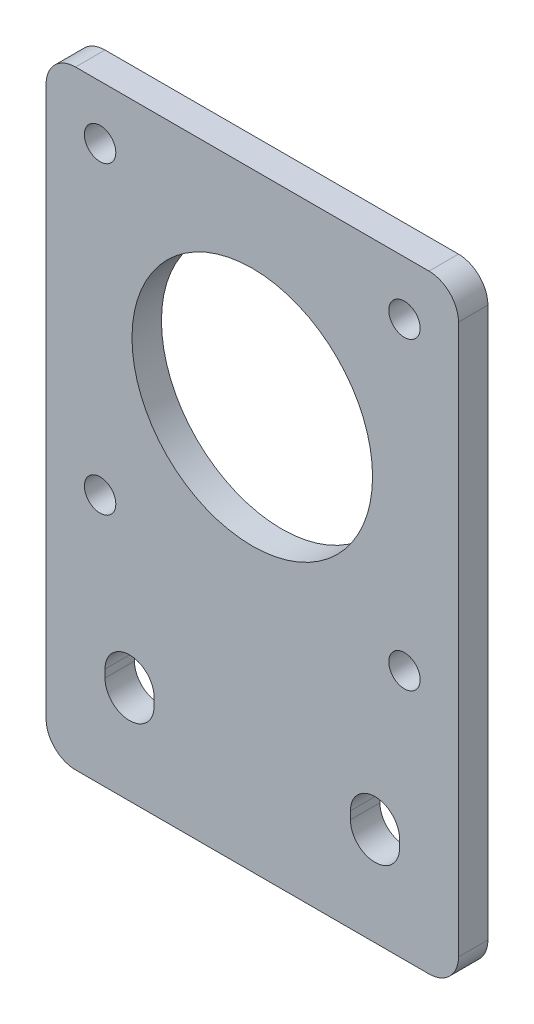
ISO-10303-21;
HEADER;
FILE_DESCRIPTION(('STEP AP214'),'2;1');
FILE_NAME('part.step','',(''),(''),'','','');
FILE_SCHEMA(('AUTOMOTIVE_DESIGN { 1 0 10303 214 1 1 1 1 }'));
ENDSEC;
DATA;
#1=APPLICATION_CONTEXT('core data for automotive mechanical design processes');
#2=APPLICATION_PROTOCOL_DEFINITION('international standard','automotive_design',2000,#1);
#3=PRODUCT_CONTEXT('',#1,'mechanical');
#4=PRODUCT('Part','Part','',(#3));
#5=PRODUCT_RELATED_PRODUCT_CATEGORY('part','',(#4));
#6=PRODUCT_DEFINITION_FORMATION('','',#4);
#7=PRODUCT_DEFINITION_CONTEXT('part definition',#1,'design');
#8=PRODUCT_DEFINITION('design','',#6,#7);
#9=PRODUCT_DEFINITION_SHAPE('','',#8);
#10=(LENGTH_UNIT() NAMED_UNIT(*) SI_UNIT(.MILLI.,.METRE.));
#11=(NAMED_UNIT(*) PLANE_ANGLE_UNIT() SI_UNIT($,.RADIAN.));
#12=(NAMED_UNIT(*) SI_UNIT($,.STERADIAN.) SOLID_ANGLE_UNIT());
#13=UNCERTAINTY_MEASURE_WITH_UNIT(LENGTH_MEASURE(1.E-05),#10,'distance_accuracy_value','');
#14=(GEOMETRIC_REPRESENTATION_CONTEXT(3) GLOBAL_UNCERTAINTY_ASSIGNED_CONTEXT((#13)) GLOBAL_UNIT_ASSIGNED_CONTEXT((#10,
#11,#12)) REPRESENTATION_CONTEXT('',''));
#15=CARTESIAN_POINT('',(0.,0.,0.));
#16=DIRECTION('',(0.,0.,1.));
#17=DIRECTION('',(1.,0.,0.));
#18=AXIS2_PLACEMENT_3D('',#15,#16,#17);
#19=CARTESIAN_POINT('',(10.,0.,3.));
#20=DIRECTION('',(-1.,0.,0.));
#21=DIRECTION('',(0.,0.,1.));
#22=AXIS2_PLACEMENT_3D('',#19,#20,#21);
#23=PLANE('',#22);
#24=DIRECTION('',(0.,1.,0.));
#25=VECTOR('',#24,1.);
#26=CARTESIAN_POINT('',(10.,0.,0.));
#27=LINE('',#26,#25);
#28=CARTESIAN_POINT('',(10.,-16.4952000783614,0.));
#29=VERTEX_POINT('',#28);
#30=CARTESIAN_POINT('',(10.,-15.6952000783614,0.));
#31=VERTEX_POINT('',#30);
#32=EDGE_CURVE('E233',#29,#31,#27,.T.);
#33=ORIENTED_EDGE('',*,*,#32,.T.);
#34=DIRECTION('',(0.,0.,-1.));
#35=VECTOR('',#34,1.);
#36=CARTESIAN_POINT('',(10.,-15.6952000783614,3.));
#37=LINE('',#36,#35);
#38=CARTESIAN_POINT('',(10.,-15.6952000783614,3.));
#39=VERTEX_POINT('',#38);
#40=EDGE_CURVE('E11',#39,#31,#37,.T.);
#41=ORIENTED_EDGE('',*,*,#40,.F.);
#42=DIRECTION('',(0.,1.,0.));
#43=VECTOR('',#42,1.);
#44=CARTESIAN_POINT('',(10.,0.,3.));
#45=LINE('',#44,#43);
#46=CARTESIAN_POINT('',(10.,-16.4952000783614,3.));
#47=VERTEX_POINT('',#46);
#48=EDGE_CURVE('E166',#47,#39,#45,.T.);
#49=ORIENTED_EDGE('',*,*,#48,.F.);
#50=DIRECTION('',(0.,0.,-1.));
#51=VECTOR('',#50,1.);
#52=CARTESIAN_POINT('',(10.,-16.4952000783614,3.));
#53=LINE('',#52,#51);
#54=EDGE_CURVE('E241',#47,#29,#53,.T.);
#55=ORIENTED_EDGE('',*,*,#54,.T.);
#56=EDGE_LOOP('',(#33,#41,#49,#55));
#57=FACE_BOUND('',#56,.T.);
#58=ADVANCED_FACE('F41',(#57),#23,.F.);
#59=CARTESIAN_POINT('',(12.5,-15.6952000783614,3.));
#60=DIRECTION('',(0.,0.,-1.));
#61=DIRECTION('',(-1.,0.,0.));
#62=AXIS2_PLACEMENT_3D('',#59,#60,#61);
#63=CYLINDRICAL_SURFACE('',#62,2.5);
#64=CARTESIAN_POINT('',(12.5,-15.6952000783614,0.));
#65=DIRECTION('',(0.,0.,1.));
#66=DIRECTION('',(1.,0.,0.));
#67=AXIS2_PLACEMENT_3D('',#64,#65,#66);
#68=CIRCLE('',#67,2.5);
#69=CARTESIAN_POINT('',(15.,-15.6952000783614,0.));
#70=VERTEX_POINT('',#69);
#71=EDGE_CURVE('E172',#31,#70,#68,.F.);
#72=ORIENTED_EDGE('',*,*,#71,.T.);
#73=DIRECTION('',(0.,0.,-1.));
#74=VECTOR('',#73,1.);
#75=CARTESIAN_POINT('',(15.,-15.6952000783614,3.));
#76=LINE('',#75,#74);
#77=CARTESIAN_POINT('',(15.,-15.6952000783614,3.));
#78=VERTEX_POINT('',#77);
#79=EDGE_CURVE('E51',#78,#70,#76,.T.);
#80=ORIENTED_EDGE('',*,*,#79,.F.);
#81=CARTESIAN_POINT('',(12.5,-15.6952000783614,3.));
#82=DIRECTION('',(0.,0.,1.));
#83=DIRECTION('',(1.,0.,0.));
#84=AXIS2_PLACEMENT_3D('',#81,#82,#83);
#85=CIRCLE('',#84,2.5);
#86=EDGE_CURVE('E160',#39,#78,#85,.F.);
#87=ORIENTED_EDGE('',*,*,#86,.F.);
#88=ORIENTED_EDGE('',*,*,#40,.T.);
#89=EDGE_LOOP('',(#72,#80,#87,#88));
#90=FACE_BOUND('',#89,.T.);
#91=ADVANCED_FACE('F171',(#90),#63,.F.);
#92=CARTESIAN_POINT('',(15.,0.,3.));
#93=DIRECTION('',(-1.,0.,0.));
#94=DIRECTION('',(0.,0.,1.));
#95=AXIS2_PLACEMENT_3D('',#92,#93,#94);
#96=PLANE('',#95);
#97=DIRECTION('',(0.,1.,0.));
#98=VECTOR('',#97,1.);
#99=CARTESIAN_POINT('',(15.,0.,0.));
#100=LINE('',#99,#98);
#101=CARTESIAN_POINT('',(15.,-16.4952000783614,0.));
#102=VERTEX_POINT('',#101);
#103=EDGE_CURVE('E237',#102,#70,#100,.T.);
#104=ORIENTED_EDGE('',*,*,#103,.F.);
#105=DIRECTION('',(0.,0.,-1.));
#106=VECTOR('',#105,1.);
#107=CARTESIAN_POINT('',(15.,-16.4952000783614,3.));
#108=LINE('',#107,#106);
#109=CARTESIAN_POINT('',(15.,-16.4952000783614,3.));
#110=VERTEX_POINT('',#109);
#111=EDGE_CURVE('E112',#110,#102,#108,.T.);
#112=ORIENTED_EDGE('',*,*,#111,.F.);
#113=DIRECTION('',(0.,1.,0.));
#114=VECTOR('',#113,1.);
#115=CARTESIAN_POINT('',(15.,0.,3.));
#116=LINE('',#115,#114);
#117=EDGE_CURVE('E164',#110,#78,#116,.T.);
#118=ORIENTED_EDGE('',*,*,#117,.T.);
#119=ORIENTED_EDGE('',*,*,#79,.T.);
#120=EDGE_LOOP('',(#104,#112,#118,#119));
#121=FACE_BOUND('',#120,.T.);
#122=ADVANCED_FACE('F177',(#121),#96,.T.);
#123=CARTESIAN_POINT('',(-12.5,-15.6952000783614,3.));
#124=DIRECTION('',(0.,0.,-1.));
#125=DIRECTION('',(-1.,0.,0.));
#126=AXIS2_PLACEMENT_3D('',#123,#124,#125);
#127=CYLINDRICAL_SURFACE('',#126,2.5);
#128=CARTESIAN_POINT('',(-12.5,-15.6952000783614,0.));
#129=DIRECTION('',(0.,0.,1.));
#130=DIRECTION('',(1.,0.,0.));
#131=AXIS2_PLACEMENT_3D('',#128,#129,#130);
#132=CIRCLE('',#131,2.5);
#133=CARTESIAN_POINT('',(-10.,-15.6952000783614,0.));
#134=VERTEX_POINT('',#133);
#135=CARTESIAN_POINT('',(-15.,-15.6952000783614,0.));
#136=VERTEX_POINT('',#135);
#137=EDGE_CURVE('E206',#134,#136,#132,.T.);
#138=ORIENTED_EDGE('',*,*,#137,.F.);
#139=DIRECTION('',(0.,0.,-1.));
#140=VECTOR('',#139,1.);
#141=CARTESIAN_POINT('',(-10.,-15.6952000783614,3.));
#142=LINE('',#141,#140);
#143=CARTESIAN_POINT('',(-10.,-15.6952000783614,3.));
#144=VERTEX_POINT('',#143);
#145=EDGE_CURVE('E243',#144,#134,#142,.T.);
#146=ORIENTED_EDGE('',*,*,#145,.F.);
#147=CARTESIAN_POINT('',(-12.5,-15.6952000783614,3.));
#148=DIRECTION('',(0.,0.,1.));
#149=DIRECTION('',(1.,0.,0.));
#150=AXIS2_PLACEMENT_3D('',#147,#148,#149);
#151=CIRCLE('',#150,2.5);
#152=CARTESIAN_POINT('',(-15.,-15.6952000783614,3.));
#153=VERTEX_POINT('',#152);
#154=EDGE_CURVE('E303',#144,#153,#151,.T.);
#155=ORIENTED_EDGE('',*,*,#154,.T.);
#156=DIRECTION('',(0.,0.,-1.));
#157=VECTOR('',#156,1.);
#158=CARTESIAN_POINT('',(-15.,-15.6952000783614,3.));
#159=LINE('',#158,#157);
#160=EDGE_CURVE('E245',#153,#136,#159,.T.);
#161=ORIENTED_EDGE('',*,*,#160,.T.);
#162=EDGE_LOOP('',(#138,#146,#155,#161));
#163=FACE_BOUND('',#162,.T.);
#164=ADVANCED_FACE('F389',(#163),#127,.F.);
#165=CARTESIAN_POINT('',(-10.,0.,3.));
#166=DIRECTION('',(-1.,0.,0.));
#167=DIRECTION('',(0.,0.,1.));
#168=AXIS2_PLACEMENT_3D('',#165,#166,#167);
#169=PLANE('',#168);
#170=DIRECTION('',(0.,1.,0.));
#171=VECTOR('',#170,1.);
#172=CARTESIAN_POINT('',(-10.,0.,0.));
#173=LINE('',#172,#171);
#174=CARTESIAN_POINT('',(-10.,-16.4952000783614,0.));
#175=VERTEX_POINT('',#174);
#176=EDGE_CURVE('E209',#175,#134,#173,.T.);
#177=ORIENTED_EDGE('',*,*,#176,.F.);
#178=DIRECTION('',(0.,0.,-1.));
#179=VECTOR('',#178,1.);
#180=CARTESIAN_POINT('',(-10.,-16.4952000783614,3.));
#181=LINE('',#180,#179);
#182=CARTESIAN_POINT('',(-10.,-16.4952000783614,3.));
#183=VERTEX_POINT('',#182);
#184=EDGE_CURVE('E249',#183,#175,#181,.T.);
#185=ORIENTED_EDGE('',*,*,#184,.F.);
#186=DIRECTION('',(0.,1.,0.));
#187=VECTOR('',#186,1.);
#188=CARTESIAN_POINT('',(-10.,0.,3.));
#189=LINE('',#188,#187);
#190=EDGE_CURVE('E306',#183,#144,#189,.T.);
#191=ORIENTED_EDGE('',*,*,#190,.T.);
#192=ORIENTED_EDGE('',*,*,#145,.T.);
#193=EDGE_LOOP('',(#177,#185,#191,#192));
#194=FACE_BOUND('',#193,.T.);
#195=ADVANCED_FACE('F385',(#194),#169,.T.);
#196=CARTESIAN_POINT('',(-12.5,-16.4952000783614,3.));
#197=DIRECTION('',(0.,0.,-1.));
#198=DIRECTION('',(-1.,0.,0.));
#199=AXIS2_PLACEMENT_3D('',#196,#197,#198);
#200=CYLINDRICAL_SURFACE('',#199,2.5);
#201=CARTESIAN_POINT('',(-12.5,-16.4952000783614,0.));
#202=DIRECTION('',(0.,0.,1.));
#203=DIRECTION('',(1.,0.,0.));
#204=AXIS2_PLACEMENT_3D('',#201,#202,#203);
#205=CIRCLE('',#204,2.5);
#206=CARTESIAN_POINT('',(-15.,-16.4952000783614,0.));
#207=VERTEX_POINT('',#206);
#208=EDGE_CURVE('E212',#207,#175,#205,.T.);
#209=ORIENTED_EDGE('',*,*,#208,.F.);
#210=DIRECTION('',(0.,0.,-1.));
#211=VECTOR('',#210,1.);
#212=CARTESIAN_POINT('',(-15.,-16.4952000783614,3.));
#213=LINE('',#212,#211);
#214=CARTESIAN_POINT('',(-15.,-16.4952000783614,3.));
#215=VERTEX_POINT('',#214);
#216=EDGE_CURVE('E247',#215,#207,#213,.T.);
#217=ORIENTED_EDGE('',*,*,#216,.F.);
#218=CARTESIAN_POINT('',(-12.5,-16.4952000783614,3.));
#219=DIRECTION('',(0.,0.,1.));
#220=DIRECTION('',(1.,0.,0.));
#221=AXIS2_PLACEMENT_3D('',#218,#219,#220);
#222=CIRCLE('',#221,2.5);
#223=EDGE_CURVE('E309',#215,#183,#222,.T.);
#224=ORIENTED_EDGE('',*,*,#223,.T.);
#225=ORIENTED_EDGE('',*,*,#184,.T.);
#226=EDGE_LOOP('',(#209,#217,#224,#225));
#227=FACE_BOUND('',#226,.T.);
#228=ADVANCED_FACE('F382',(#227),#200,.F.);
#229=CARTESIAN_POINT('',(0.,-26.0952000783614,3.));
#230=DIRECTION('',(0.,-1.,0.));
#231=DIRECTION('',(1.,0.,0.));
#232=AXIS2_PLACEMENT_3D('',#229,#230,#231);
#233=PLANE('',#232);
#234=DIRECTION('',(-1.,0.,0.));
#235=VECTOR('',#234,1.);
#236=CARTESIAN_POINT('',(0.,-26.0952000783614,0.));
#237=LINE('',#236,#235);
#238=CARTESIAN_POINT('',(18.,-26.0952000783614,0.));
#239=VERTEX_POINT('',#238);
#240=CARTESIAN_POINT('',(-18.,-26.0952000783614,0.));
#241=VERTEX_POINT('',#240);
#242=EDGE_CURVE('E183',#239,#241,#237,.T.);
#243=ORIENTED_EDGE('',*,*,#242,.F.);
#244=DIRECTION('',(0.,0.,-1.));
#245=VECTOR('',#244,1.);
#246=CARTESIAN_POINT('',(18.,-26.0952000783614,3.));
#247=LINE('',#246,#245);
#248=CARTESIAN_POINT('',(18.,-26.0952000783614,3.));
#249=VERTEX_POINT('',#248);
#250=EDGE_CURVE('E45',#249,#239,#247,.T.);
#251=ORIENTED_EDGE('',*,*,#250,.F.);
#252=DIRECTION('',(-1.,0.,0.));
#253=VECTOR('',#252,1.);
#254=CARTESIAN_POINT('',(0.,-26.0952000783614,3.));
#255=LINE('',#254,#253);
#256=CARTESIAN_POINT('',(-18.,-26.0952000783614,3.));
#257=VERTEX_POINT('',#256);
#258=EDGE_CURVE('E240',#249,#257,#255,.T.);
#259=ORIENTED_EDGE('',*,*,#258,.T.);
#260=DIRECTION('',(0.,0.,-1.));
#261=VECTOR('',#260,1.);
#262=CARTESIAN_POINT('',(-18.,-26.0952000783614,3.));
#263=LINE('',#262,#261);
#264=EDGE_CURVE('E179',#257,#241,#263,.T.);
#265=ORIENTED_EDGE('',*,*,#264,.T.);
#266=EDGE_LOOP('',(#243,#251,#259,#265));
#267=FACE_BOUND('',#266,.T.);
#268=ADVANCED_FACE('F43',(#267),#233,.T.);
#269=CARTESIAN_POINT('',(18.,-23.0952000783614,3.));
#270=DIRECTION('',(0.,0.,-1.));
#271=DIRECTION('',(-1.,0.,0.));
#272=AXIS2_PLACEMENT_3D('',#269,#270,#271);
#273=CYLINDRICAL_SURFACE('',#272,3.);
#274=CARTESIAN_POINT('',(18.,-23.0952000783614,0.));
#275=DIRECTION('',(0.,0.,1.));
#276=DIRECTION('',(1.,0.,0.));
#277=AXIS2_PLACEMENT_3D('',#274,#275,#276);
#278=CIRCLE('',#277,3.);
#279=CARTESIAN_POINT('',(21.,-23.0952000783614,0.));
#280=VERTEX_POINT('',#279);
#281=EDGE_CURVE('E186',#280,#239,#278,.F.);
#282=ORIENTED_EDGE('',*,*,#281,.F.);
#283=DIRECTION('',(0.,0.,-1.));
#284=VECTOR('',#283,1.);
#285=CARTESIAN_POINT('',(21.,-23.0952000783614,3.));
#286=LINE('',#285,#284);
#287=CARTESIAN_POINT('',(21.,-23.0952000783614,3.));
#288=VERTEX_POINT('',#287);
#289=EDGE_CURVE('E263',#288,#280,#286,.T.);
#290=ORIENTED_EDGE('',*,*,#289,.F.);
#291=CARTESIAN_POINT('',(18.,-23.0952000783614,3.));
#292=DIRECTION('',(0.,0.,1.));
#293=DIRECTION('',(1.,0.,0.));
#294=AXIS2_PLACEMENT_3D('',#291,#292,#293);
#295=CIRCLE('',#294,3.);
#296=EDGE_CURVE('E272',#288,#249,#295,.F.);
#297=ORIENTED_EDGE('',*,*,#296,.T.);
#298=ORIENTED_EDGE('',*,*,#250,.T.);
#299=EDGE_LOOP('',(#282,#290,#297,#298));
#300=FACE_BOUND('',#299,.T.);
#301=ADVANCED_FACE('F270',(#300),#273,.T.);
#302=CARTESIAN_POINT('',(21.,0.,3.));
#303=DIRECTION('',(-1.,0.,0.));
#304=DIRECTION('',(0.,-1.,0.));
#305=AXIS2_PLACEMENT_3D('',#302,#303,#304);
#306=PLANE('',#305);
#307=DIRECTION('',(0.,1.,0.));
#308=VECTOR('',#307,1.);
#309=CARTESIAN_POINT('',(21.,0.,0.));
#310=LINE('',#309,#308);
#311=CARTESIAN_POINT('',(21.,32.9047999216386,0.));
#312=VERTEX_POINT('',#311);
#313=EDGE_CURVE('E189',#280,#312,#310,.T.);
#314=ORIENTED_EDGE('',*,*,#313,.T.);
#315=DIRECTION('',(0.,0.,-1.));
#316=VECTOR('',#315,1.);
#317=CARTESIAN_POINT('',(21.,32.9047999216386,3.));
#318=LINE('',#317,#316);
#319=CARTESIAN_POINT('',(21.,32.9047999216386,3.));
#320=VERTEX_POINT('',#319);
#321=EDGE_CURVE('E262',#320,#312,#318,.T.);
#322=ORIENTED_EDGE('',*,*,#321,.F.);
#323=DIRECTION('',(0.,1.,0.));
#324=VECTOR('',#323,1.);
#325=CARTESIAN_POINT('',(21.,0.,3.));
#326=LINE('',#325,#324);
#327=EDGE_CURVE('E283',#288,#320,#326,.T.);
#328=ORIENTED_EDGE('',*,*,#327,.F.);
#329=ORIENTED_EDGE('',*,*,#289,.T.);
#330=EDGE_LOOP('',(#314,#322,#328,#329));
#331=FACE_BOUND('',#330,.T.);
#332=ADVANCED_FACE('F281',(#331),#306,.F.);
#333=CARTESIAN_POINT('',(18.,32.9047999216386,3.));
#334=DIRECTION('',(0.,0.,-1.));
#335=DIRECTION('',(-1.,0.,0.));
#336=AXIS2_PLACEMENT_3D('',#333,#334,#335);
#337=CYLINDRICAL_SURFACE('',#336,3.);
#338=CARTESIAN_POINT('',(18.,32.9047999216386,0.));
#339=DIRECTION('',(0.,0.,1.));
#340=DIRECTION('',(1.,0.,0.));
#341=AXIS2_PLACEMENT_3D('',#338,#339,#340);
#342=CIRCLE('',#341,3.);
#343=CARTESIAN_POINT('',(18.,35.9047999216386,0.));
#344=VERTEX_POINT('',#343);
#345=EDGE_CURVE('E192',#344,#312,#342,.F.);
#346=ORIENTED_EDGE('',*,*,#345,.F.);
#347=DIRECTION('',(0.,0.,-1.));
#348=VECTOR('',#347,1.);
#349=CARTESIAN_POINT('',(18.,35.9047999216386,3.));
#350=LINE('',#349,#348);
#351=CARTESIAN_POINT('',(18.,35.9047999216386,3.));
#352=VERTEX_POINT('',#351);
#353=EDGE_CURVE('E260',#352,#344,#350,.T.);
#354=ORIENTED_EDGE('',*,*,#353,.F.);
#355=CARTESIAN_POINT('',(18.,32.9047999216386,3.));
#356=DIRECTION('',(0.,0.,1.));
#357=DIRECTION('',(1.,0.,0.));
#358=AXIS2_PLACEMENT_3D('',#355,#356,#357);
#359=CIRCLE('',#358,3.);
#360=EDGE_CURVE('E286',#352,#320,#359,.F.);
#361=ORIENTED_EDGE('',*,*,#360,.T.);
#362=ORIENTED_EDGE('',*,*,#321,.T.);
#363=EDGE_LOOP('',(#346,#354,#361,#362));
#364=FACE_BOUND('',#363,.T.);
#365=ADVANCED_FACE('F287',(#364),#337,.T.);
#366=CARTESIAN_POINT('',(0.,35.9047999216386,3.));
#367=DIRECTION('',(0.,-1.,0.));
#368=DIRECTION('',(0.,0.,-1.));
#369=AXIS2_PLACEMENT_3D('',#366,#367,#368);
#370=PLANE('',#369);
#371=DIRECTION('',(-1.,0.,0.));
#372=VECTOR('',#371,1.);
#373=CARTESIAN_POINT('',(0.,35.9047999216386,0.));
#374=LINE('',#373,#372);
#375=CARTESIAN_POINT('',(-18.,35.9047999216386,0.));
#376=VERTEX_POINT('',#375);
#377=EDGE_CURVE('E195',#344,#376,#374,.T.);
#378=ORIENTED_EDGE('',*,*,#377,.T.);
#379=DIRECTION('',(0.,0.,-1.));
#380=VECTOR('',#379,1.);
#381=CARTESIAN_POINT('',(-18.,35.9047999216386,3.));
#382=LINE('',#381,#380);
#383=CARTESIAN_POINT('',(-18.,35.9047999216386,3.));
#384=VERTEX_POINT('',#383);
#385=EDGE_CURVE('E257',#384,#376,#382,.T.);
#386=ORIENTED_EDGE('',*,*,#385,.F.);
#387=DIRECTION('',(-1.,0.,0.));
#388=VECTOR('',#387,1.);
#389=CARTESIAN_POINT('',(0.,35.9047999216386,3.));
#390=LINE('',#389,#388);
#391=EDGE_CURVE('E290',#352,#384,#390,.T.);
#392=ORIENTED_EDGE('',*,*,#391,.F.);
#393=ORIENTED_EDGE('',*,*,#353,.T.);
#394=EDGE_LOOP('',(#378,#386,#392,#393));
#395=FACE_BOUND('',#394,.T.);
#396=ADVANCED_FACE('F400',(#395),#370,.F.);
#397=CARTESIAN_POINT('',(-18.,32.9047999216386,3.));
#398=DIRECTION('',(0.,0.,-1.));
#399=DIRECTION('',(-1.,0.,0.));
#400=AXIS2_PLACEMENT_3D('',#397,#398,#399);
#401=CYLINDRICAL_SURFACE('',#400,3.);
#402=CARTESIAN_POINT('',(-18.,32.9047999216386,0.));
#403=DIRECTION('',(0.,0.,1.));
#404=DIRECTION('',(1.,0.,0.));
#405=AXIS2_PLACEMENT_3D('',#402,#403,#404);
#406=CIRCLE('',#405,3.);
#407=CARTESIAN_POINT('',(-21.,32.9047999216386,0.));
#408=VERTEX_POINT('',#407);
#409=EDGE_CURVE('E197',#376,#408,#406,.T.);
#410=ORIENTED_EDGE('',*,*,#409,.T.);
#411=DIRECTION('',(0.,0.,-1.));
#412=VECTOR('',#411,1.);
#413=CARTESIAN_POINT('',(-21.,32.9047999216386,3.));
#414=LINE('',#413,#412);
#415=CARTESIAN_POINT('',(-21.,32.9047999216386,3.));
#416=VERTEX_POINT('',#415);
#417=EDGE_CURVE('E255',#416,#408,#414,.T.);
#418=ORIENTED_EDGE('',*,*,#417,.F.);
#419=CARTESIAN_POINT('',(-18.,32.9047999216386,3.));
#420=DIRECTION('',(0.,0.,1.));
#421=DIRECTION('',(1.,0.,0.));
#422=AXIS2_PLACEMENT_3D('',#419,#420,#421);
#423=CIRCLE('',#422,3.);
#424=EDGE_CURVE('E292',#384,#416,#423,.T.);
#425=ORIENTED_EDGE('',*,*,#424,.F.);
#426=ORIENTED_EDGE('',*,*,#385,.T.);
#427=EDGE_LOOP('',(#410,#418,#425,#426));
#428=FACE_BOUND('',#427,.T.);
#429=ADVANCED_FACE('F396',(#428),#401,.T.);
#430=CARTESIAN_POINT('',(-21.,0.,3.));
#431=DIRECTION('',(-1.,0.,0.));
#432=DIRECTION('',(0.,0.,1.));
#433=AXIS2_PLACEMENT_3D('',#430,#431,#432);
#434=PLANE('',#433);
#435=DIRECTION('',(0.,1.,0.));
#436=VECTOR('',#435,1.);
#437=CARTESIAN_POINT('',(-21.,0.,0.));
#438=LINE('',#437,#436);
#439=CARTESIAN_POINT('',(-21.,-23.0952000783614,0.));
#440=VERTEX_POINT('',#439);
#441=EDGE_CURVE('E200',#440,#408,#438,.T.);
#442=ORIENTED_EDGE('',*,*,#441,.F.);
#443=DIRECTION('',(0.,0.,-1.));
#444=VECTOR('',#443,1.);
#445=CARTESIAN_POINT('',(-21.,-23.0952000783614,3.));
#446=LINE('',#445,#444);
#447=CARTESIAN_POINT('',(-21.,-23.0952000783614,3.));
#448=VERTEX_POINT('',#447);
#449=EDGE_CURVE('E253',#448,#440,#446,.T.);
#450=ORIENTED_EDGE('',*,*,#449,.F.);
#451=DIRECTION('',(0.,1.,0.));
#452=VECTOR('',#451,1.);
#453=CARTESIAN_POINT('',(-21.,0.,3.));
#454=LINE('',#453,#452);
#455=EDGE_CURVE('E298',#448,#416,#454,.T.);
#456=ORIENTED_EDGE('',*,*,#455,.T.);
#457=ORIENTED_EDGE('',*,*,#417,.T.);
#458=EDGE_LOOP('',(#442,#450,#456,#457));
#459=FACE_BOUND('',#458,.T.);
#460=ADVANCED_FACE('F335',(#459),#434,.T.);
#461=CARTESIAN_POINT('',(15.5,30.4047999216386,3.));
#462=DIRECTION('',(0.,0.,-1.));
#463=DIRECTION('',(-1.,0.,0.));
#464=AXIS2_PLACEMENT_3D('',#461,#462,#463);
#465=CYLINDRICAL_SURFACE('',#464,1.6);
#466=CARTESIAN_POINT('',(15.5,30.4047999216386,3.));
#467=DIRECTION('',(0.,0.,1.));
#468=DIRECTION('',(1.,0.,0.));
#469=AXIS2_PLACEMENT_3D('',#466,#467,#468);
#470=CIRCLE('',#469,1.6);
#471=CARTESIAN_POINT('',(17.1,30.4047999216386,3.));
#472=VERTEX_POINT('',#471);
#473=EDGE_CURVE('E326',#472,#472,#470,.F.);
#474=ORIENTED_EDGE('',*,*,#473,.F.);
#475=EDGE_LOOP('',(#474));
#476=FACE_BOUND('',#475,.T.);
#477=CARTESIAN_POINT('',(15.5,30.4047999216386,0.));
#478=DIRECTION('',(0.,0.,1.));
#479=DIRECTION('',(1.,0.,0.));
#480=AXIS2_PLACEMENT_3D('',#477,#478,#479);
#481=CIRCLE('',#480,1.6);
#482=CARTESIAN_POINT('',(17.1,30.4047999216386,0.));
#483=VERTEX_POINT('',#482);
#484=EDGE_CURVE('E230',#483,#483,#481,.F.);
#485=ORIENTED_EDGE('',*,*,#484,.T.);
#486=EDGE_LOOP('',(#485));
#487=FACE_BOUND('',#486,.T.);
#488=ADVANCED_FACE('F331',(#476,#487),#465,.F.);
#489=CARTESIAN_POINT('',(15.5,-0.595200078361362,3.));
#490=DIRECTION('',(0.,0.,-1.));
#491=DIRECTION('',(-1.,0.,0.));
#492=AXIS2_PLACEMENT_3D('',#489,#490,#491);
#493=CYLINDRICAL_SURFACE('',#492,1.6);
#494=CARTESIAN_POINT('',(15.5,-0.595200078361362,3.));
#495=DIRECTION('',(0.,0.,1.));
#496=DIRECTION('',(1.,0.,0.));
#497=AXIS2_PLACEMENT_3D('',#494,#495,#496);
#498=CIRCLE('',#497,1.6);
#499=CARTESIAN_POINT('',(17.1,-0.595200078361362,3.));
#500=VERTEX_POINT('',#499);
#501=EDGE_CURVE('E323',#500,#500,#498,.F.);
#502=ORIENTED_EDGE('',*,*,#501,.F.);
#503=EDGE_LOOP('',(#502));
#504=FACE_BOUND('',#503,.T.);
#505=CARTESIAN_POINT('',(15.5,-0.595200078361362,0.));
#506=DIRECTION('',(0.,0.,1.));
#507=DIRECTION('',(1.,0.,0.));
#508=AXIS2_PLACEMENT_3D('',#505,#506,#507);
#509=CIRCLE('',#508,1.6);
#510=CARTESIAN_POINT('',(17.1,-0.595200078361362,0.));
#511=VERTEX_POINT('',#510);
#512=EDGE_CURVE('E227',#511,#511,#509,.F.);
#513=ORIENTED_EDGE('',*,*,#512,.T.);
#514=EDGE_LOOP('',(#513));
#515=FACE_BOUND('',#514,.T.);
#516=ADVANCED_FACE('F334',(#504,#515),#493,.F.);
#517=CARTESIAN_POINT('',(0.,14.9047999216381,3.));
#518=DIRECTION('',(0.,0.,-1.));
#519=DIRECTION('',(-1.,0.,0.));
#520=AXIS2_PLACEMENT_3D('',#517,#518,#519);
#521=CYLINDRICAL_SURFACE('',#520,12.25);
#522=CARTESIAN_POINT('',(0.,14.9047999216381,3.));
#523=DIRECTION('',(0.,0.,1.));
#524=DIRECTION('',(1.,0.,0.));
#525=AXIS2_PLACEMENT_3D('',#522,#523,#524);
#526=CIRCLE('',#525,12.25);
#527=CARTESIAN_POINT('',(12.25,14.9047999216381,3.));
#528=VERTEX_POINT('',#527);
#529=EDGE_CURVE('E320',#528,#528,#526,.T.);
#530=ORIENTED_EDGE('',*,*,#529,.T.);
#531=EDGE_LOOP('',(#530));
#532=FACE_BOUND('',#531,.T.);
#533=CARTESIAN_POINT('',(0.,14.9047999216381,0.));
#534=DIRECTION('',(0.,0.,1.));
#535=DIRECTION('',(1.,0.,0.));
#536=AXIS2_PLACEMENT_3D('',#533,#534,#535);
#537=CIRCLE('',#536,12.25);
#538=CARTESIAN_POINT('',(12.25,14.9047999216381,0.));
#539=VERTEX_POINT('',#538);
#540=EDGE_CURVE('E224',#539,#539,#537,.T.);
#541=ORIENTED_EDGE('',*,*,#540,.F.);
#542=EDGE_LOOP('',(#541));
#543=FACE_BOUND('',#542,.T.);
#544=ADVANCED_FACE('F366',(#532,#543),#521,.F.);
#545=CARTESIAN_POINT('',(-15.5,-0.59520007836137,3.));
#546=DIRECTION('',(0.,0.,-1.));
#547=DIRECTION('',(-1.,0.,0.));
#548=AXIS2_PLACEMENT_3D('',#545,#546,#547);
#549=CYLINDRICAL_SURFACE('',#548,1.6);
#550=CARTESIAN_POINT('',(-15.5,-0.59520007836137,3.));
#551=DIRECTION('',(0.,0.,1.));
#552=DIRECTION('',(1.,0.,0.));
#553=AXIS2_PLACEMENT_3D('',#550,#551,#552);
#554=CIRCLE('',#553,1.6);
#555=CARTESIAN_POINT('',(-13.9,-0.59520007836137,3.));
#556=VERTEX_POINT('',#555);
#557=EDGE_CURVE('E317',#556,#556,#554,.T.);
#558=ORIENTED_EDGE('',*,*,#557,.T.);
#559=EDGE_LOOP('',(#558));
#560=FACE_BOUND('',#559,.T.);
#561=CARTESIAN_POINT('',(-15.5,-0.59520007836137,0.));
#562=DIRECTION('',(0.,0.,1.));
#563=DIRECTION('',(1.,0.,0.));
#564=AXIS2_PLACEMENT_3D('',#561,#562,#563);
#565=CIRCLE('',#564,1.6);
#566=CARTESIAN_POINT('',(-13.9,-0.59520007836137,0.));
#567=VERTEX_POINT('',#566);
#568=EDGE_CURVE('E221',#567,#567,#565,.T.);
#569=ORIENTED_EDGE('',*,*,#568,.F.);
#570=EDGE_LOOP('',(#569));
#571=FACE_BOUND('',#570,.T.);
#572=ADVANCED_FACE('F370',(#560,#571),#549,.F.);
#573=CARTESIAN_POINT('',(-15.5,30.4047999216386,3.));
#574=DIRECTION('',(0.,0.,-1.));
#575=DIRECTION('',(-1.,0.,0.));
#576=AXIS2_PLACEMENT_3D('',#573,#574,#575);
#577=CYLINDRICAL_SURFACE('',#576,1.6);
#578=CARTESIAN_POINT('',(-15.5,30.4047999216386,3.));
#579=DIRECTION('',(0.,0.,1.));
#580=DIRECTION('',(1.,0.,0.));
#581=AXIS2_PLACEMENT_3D('',#578,#579,#580);
#582=CIRCLE('',#581,1.6);
#583=CARTESIAN_POINT('',(-13.9,30.4047999216386,3.));
#584=VERTEX_POINT('',#583);
#585=EDGE_CURVE('E314',#584,#584,#582,.T.);
#586=ORIENTED_EDGE('',*,*,#585,.T.);
#587=EDGE_LOOP('',(#586));
#588=FACE_BOUND('',#587,.T.);
#589=CARTESIAN_POINT('',(-15.5,30.4047999216386,0.));
#590=DIRECTION('',(0.,0.,1.));
#591=DIRECTION('',(1.,0.,0.));
#592=AXIS2_PLACEMENT_3D('',#589,#590,#591);
#593=CIRCLE('',#592,1.6);
#594=CARTESIAN_POINT('',(-13.9,30.4047999216386,0.));
#595=VERTEX_POINT('',#594);
#596=EDGE_CURVE('E218',#595,#595,#593,.T.);
#597=ORIENTED_EDGE('',*,*,#596,.F.);
#598=EDGE_LOOP('',(#597));
#599=FACE_BOUND('',#598,.T.);
#600=ADVANCED_FACE('F374',(#588,#599),#577,.F.);
#601=CARTESIAN_POINT('',(-15.,0.,3.));
#602=DIRECTION('',(-1.,0.,0.));
#603=DIRECTION('',(0.,0.,1.));
#604=AXIS2_PLACEMENT_3D('',#601,#602,#603);
#605=PLANE('',#604);
#606=DIRECTION('',(0.,1.,0.));
#607=VECTOR('',#606,1.);
#608=CARTESIAN_POINT('',(-15.,0.,0.));
#609=LINE('',#608,#607);
#610=EDGE_CURVE('E215',#207,#136,#609,.T.);
#611=ORIENTED_EDGE('',*,*,#610,.T.);
#612=ORIENTED_EDGE('',*,*,#160,.F.);
#613=DIRECTION('',(0.,1.,0.));
#614=VECTOR('',#613,1.);
#615=CARTESIAN_POINT('',(-15.,0.,3.));
#616=LINE('',#615,#614);
#617=EDGE_CURVE('E312',#215,#153,#616,.T.);
#618=ORIENTED_EDGE('',*,*,#617,.F.);
#619=ORIENTED_EDGE('',*,*,#216,.T.);
#620=EDGE_LOOP('',(#611,#612,#618,#619));
#621=FACE_BOUND('',#620,.T.);
#622=ADVANCED_FACE('F353',(#621),#605,.F.);
#623=CARTESIAN_POINT('',(-18.,-23.0952000783614,3.));
#624=DIRECTION('',(0.,0.,-1.));
#625=DIRECTION('',(-1.,0.,0.));
#626=AXIS2_PLACEMENT_3D('',#623,#624,#625);
#627=CYLINDRICAL_SURFACE('',#626,3.);
#628=CARTESIAN_POINT('',(-18.,-23.0952000783614,0.));
#629=DIRECTION('',(0.,0.,1.));
#630=DIRECTION('',(1.,0.,0.));
#631=AXIS2_PLACEMENT_3D('',#628,#629,#630);
#632=CIRCLE('',#631,3.);
#633=EDGE_CURVE('E203',#440,#241,#632,.T.);
#634=ORIENTED_EDGE('',*,*,#633,.T.);
#635=ORIENTED_EDGE('',*,*,#264,.F.);
#636=CARTESIAN_POINT('',(-18.,-23.0952000783614,3.));
#637=DIRECTION('',(0.,0.,1.));
#638=DIRECTION('',(1.,0.,0.));
#639=AXIS2_PLACEMENT_3D('',#636,#637,#638);
#640=CIRCLE('',#639,3.);
#641=EDGE_CURVE('E301',#448,#257,#640,.T.);
#642=ORIENTED_EDGE('',*,*,#641,.F.);
#643=ORIENTED_EDGE('',*,*,#449,.T.);
#644=EDGE_LOOP('',(#634,#635,#642,#643));
#645=FACE_BOUND('',#644,.T.);
#646=ADVANCED_FACE('F346',(#645),#627,.T.);
#647=CARTESIAN_POINT('',(12.5,-16.4952000783614,3.));
#648=DIRECTION('',(0.,0.,-1.));
#649=DIRECTION('',(-1.,0.,0.));
#650=AXIS2_PLACEMENT_3D('',#647,#648,#649);
#651=CYLINDRICAL_SURFACE('',#650,2.5);
#652=CARTESIAN_POINT('',(12.5,-16.4952000783614,0.));
#653=DIRECTION('',(0.,0.,1.));
#654=DIRECTION('',(1.,0.,0.));
#655=AXIS2_PLACEMENT_3D('',#652,#653,#654);
#656=CIRCLE('',#655,2.5);
#657=EDGE_CURVE('E115',#102,#29,#656,.F.);
#658=ORIENTED_EDGE('',*,*,#657,.T.);
#659=ORIENTED_EDGE('',*,*,#54,.F.);
#660=CARTESIAN_POINT('',(12.5,-16.4952000783614,3.));
#661=DIRECTION('',(0.,0.,1.));
#662=DIRECTION('',(1.,0.,0.));
#663=AXIS2_PLACEMENT_3D('',#660,#661,#662);
#664=CIRCLE('',#663,2.5);
#665=EDGE_CURVE('E60',#110,#47,#664,.F.);
#666=ORIENTED_EDGE('',*,*,#665,.F.);
#667=ORIENTED_EDGE('',*,*,#111,.T.);
#668=EDGE_LOOP('',(#658,#659,#666,#667));
#669=FACE_BOUND('',#668,.T.);
#670=ADVANCED_FACE('F344',(#669),#651,.F.);
#671=CARTESIAN_POINT('',(0.,0.,3.));
#672=DIRECTION('',(0.,0.,1.));
#673=DIRECTION('',(1.,0.,0.));
#674=AXIS2_PLACEMENT_3D('',#671,#672,#673);
#675=PLANE('',#674);
#676=ORIENTED_EDGE('',*,*,#258,.F.);
#677=ORIENTED_EDGE('',*,*,#296,.F.);
#678=ORIENTED_EDGE('',*,*,#327,.T.);
#679=ORIENTED_EDGE('',*,*,#360,.F.);
#680=ORIENTED_EDGE('',*,*,#391,.T.);
#681=ORIENTED_EDGE('',*,*,#424,.T.);
#682=ORIENTED_EDGE('',*,*,#455,.F.);
#683=ORIENTED_EDGE('',*,*,#641,.T.);
#684=EDGE_LOOP('',(#676,#677,#678,#679,#680,#681,#682,#683));
#685=FACE_BOUND('',#684,.T.);
#686=ORIENTED_EDGE('',*,*,#154,.F.);
#687=ORIENTED_EDGE('',*,*,#190,.F.);
#688=ORIENTED_EDGE('',*,*,#223,.F.);
#689=ORIENTED_EDGE('',*,*,#617,.T.);
#690=EDGE_LOOP('',(#686,#687,#688,#689));
#691=FACE_BOUND('',#690,.T.);
#692=ORIENTED_EDGE('',*,*,#585,.F.);
#693=EDGE_LOOP('',(#692));
#694=FACE_BOUND('',#693,.T.);
#695=ORIENTED_EDGE('',*,*,#557,.F.);
#696=EDGE_LOOP('',(#695));
#697=FACE_BOUND('',#696,.T.);
#698=ORIENTED_EDGE('',*,*,#529,.F.);
#699=EDGE_LOOP('',(#698));
#700=FACE_BOUND('',#699,.T.);
#701=ORIENTED_EDGE('',*,*,#501,.T.);
#702=EDGE_LOOP('',(#701));
#703=FACE_BOUND('',#702,.T.);
#704=ORIENTED_EDGE('',*,*,#473,.T.);
#705=EDGE_LOOP('',(#704));
#706=FACE_BOUND('',#705,.T.);
#707=ORIENTED_EDGE('',*,*,#48,.T.);
#708=ORIENTED_EDGE('',*,*,#86,.T.);
#709=ORIENTED_EDGE('',*,*,#117,.F.);
#710=ORIENTED_EDGE('',*,*,#665,.T.);
#711=EDGE_LOOP('',(#707,#708,#709,#710));
#712=FACE_BOUND('',#711,.T.);
#713=ADVANCED_FACE('F162',(#685,#691,#694,#697,#700,#703,#706,#712),#675,.T.);
#714=CARTESIAN_POINT('',(0.,0.,0.));
#715=DIRECTION('',(0.,0.,1.));
#716=DIRECTION('',(1.,0.,0.));
#717=AXIS2_PLACEMENT_3D('',#714,#715,#716);
#718=PLANE('',#717);
#719=ORIENTED_EDGE('',*,*,#242,.T.);
#720=ORIENTED_EDGE('',*,*,#633,.F.);
#721=ORIENTED_EDGE('',*,*,#441,.T.);
#722=ORIENTED_EDGE('',*,*,#409,.F.);
#723=ORIENTED_EDGE('',*,*,#377,.F.);
#724=ORIENTED_EDGE('',*,*,#345,.T.);
#725=ORIENTED_EDGE('',*,*,#313,.F.);
#726=ORIENTED_EDGE('',*,*,#281,.T.);
#727=EDGE_LOOP('',(#719,#720,#721,#722,#723,#724,#725,#726));
#728=FACE_BOUND('',#727,.T.);
#729=ORIENTED_EDGE('',*,*,#137,.T.);
#730=ORIENTED_EDGE('',*,*,#610,.F.);
#731=ORIENTED_EDGE('',*,*,#208,.T.);
#732=ORIENTED_EDGE('',*,*,#176,.T.);
#733=EDGE_LOOP('',(#729,#730,#731,#732));
#734=FACE_BOUND('',#733,.T.);
#735=ORIENTED_EDGE('',*,*,#596,.T.);
#736=EDGE_LOOP('',(#735));
#737=FACE_BOUND('',#736,.T.);
#738=ORIENTED_EDGE('',*,*,#568,.T.);
#739=EDGE_LOOP('',(#738));
#740=FACE_BOUND('',#739,.T.);
#741=ORIENTED_EDGE('',*,*,#540,.T.);
#742=EDGE_LOOP('',(#741));
#743=FACE_BOUND('',#742,.T.);
#744=ORIENTED_EDGE('',*,*,#512,.F.);
#745=EDGE_LOOP('',(#744));
#746=FACE_BOUND('',#745,.T.);
#747=ORIENTED_EDGE('',*,*,#484,.F.);
#748=EDGE_LOOP('',(#747));
#749=FACE_BOUND('',#748,.T.);
#750=ORIENTED_EDGE('',*,*,#32,.F.);
#751=ORIENTED_EDGE('',*,*,#657,.F.);
#752=ORIENTED_EDGE('',*,*,#103,.T.);
#753=ORIENTED_EDGE('',*,*,#71,.F.);
#754=EDGE_LOOP('',(#750,#751,#752,#753));
#755=FACE_BOUND('',#754,.T.);
#756=ADVANCED_FACE('F276',(#728,#734,#737,#740,#743,#746,#749,#755),#718,.F.);
#757=CLOSED_SHELL('',(#58,#91,#122,#164,#195,#228,#268,#301,#332,#365,#396,#429,#460,#488,#516,
#544,#572,#600,#622,#646,#670,#713,#756));
#758=MANIFOLD_SOLID_BREP('B2',#757);
#759=ADVANCED_BREP_SHAPE_REPRESENTATION('',(#18,#758),#14);
#760=SHAPE_DEFINITION_REPRESENTATION(#9,#759);
ENDSEC;
END-ISO-10303-21;
